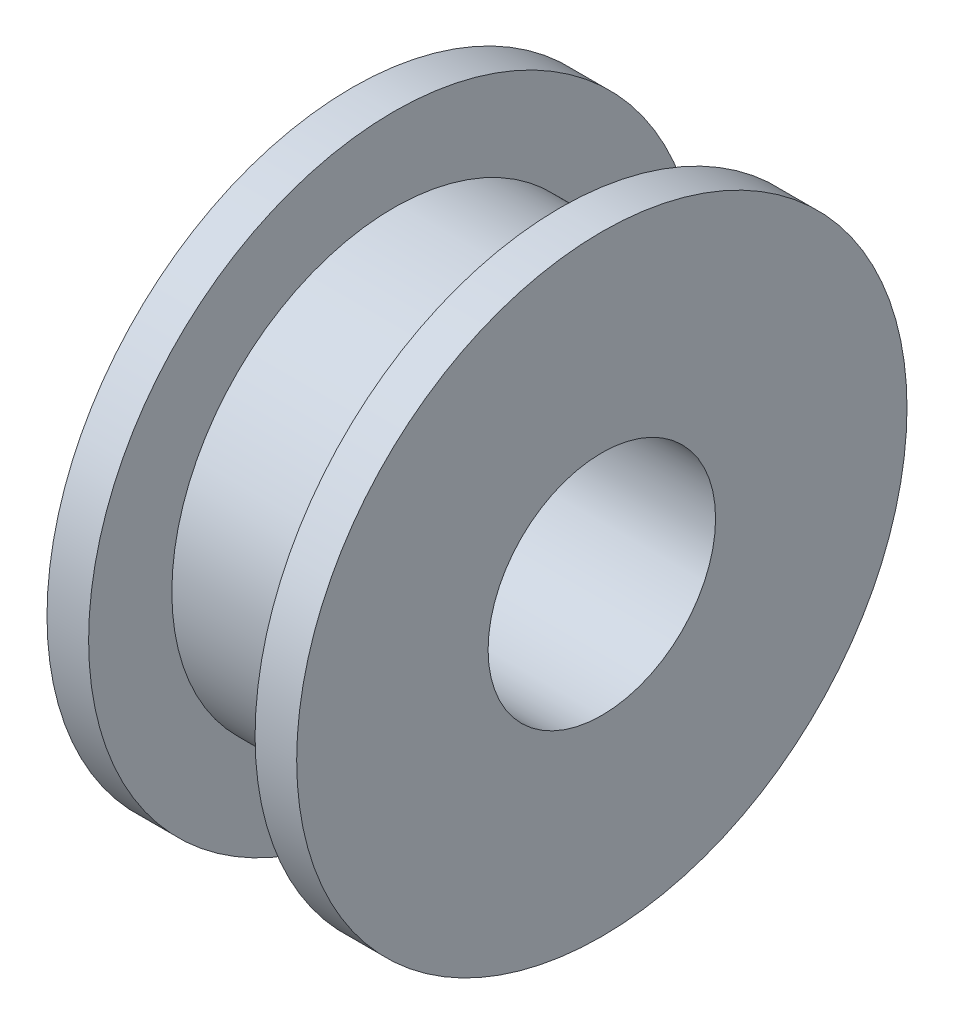
ISO-10303-21;
HEADER;
FILE_DESCRIPTION(('STEP AP214'),'2;1');
FILE_NAME('part.step','',(''),(''),'','','');
FILE_SCHEMA(('AUTOMOTIVE_DESIGN { 1 0 10303 214 1 1 1 1 }'));
ENDSEC;
DATA;
#1=APPLICATION_CONTEXT('core data for automotive mechanical design processes');
#2=APPLICATION_PROTOCOL_DEFINITION('international standard','automotive_design',2000,#1);
#3=PRODUCT_CONTEXT('',#1,'mechanical');
#4=PRODUCT('Part','Part','',(#3));
#5=PRODUCT_RELATED_PRODUCT_CATEGORY('part','',(#4));
#6=PRODUCT_DEFINITION_FORMATION('','',#4);
#7=PRODUCT_DEFINITION_CONTEXT('part definition',#1,'design');
#8=PRODUCT_DEFINITION('design','',#6,#7);
#9=PRODUCT_DEFINITION_SHAPE('','',#8);
#10=(LENGTH_UNIT() NAMED_UNIT(*) SI_UNIT(.MILLI.,.METRE.));
#11=(NAMED_UNIT(*) PLANE_ANGLE_UNIT() SI_UNIT($,.RADIAN.));
#12=(NAMED_UNIT(*) SI_UNIT($,.STERADIAN.) SOLID_ANGLE_UNIT());
#13=UNCERTAINTY_MEASURE_WITH_UNIT(LENGTH_MEASURE(1.E-05),#10,'distance_accuracy_value','');
#14=(GEOMETRIC_REPRESENTATION_CONTEXT(3) GLOBAL_UNCERTAINTY_ASSIGNED_CONTEXT((#13)) GLOBAL_UNIT_ASSIGNED_CONTEXT((#10,
#11,#12)) REPRESENTATION_CONTEXT('',''));
#15=CARTESIAN_POINT('',(0.,0.,0.));
#16=DIRECTION('',(0.,0.,1.));
#17=DIRECTION('',(1.,0.,0.));
#18=AXIS2_PLACEMENT_3D('',#15,#16,#17);
#19=CARTESIAN_POINT('',(0.,0.,0.));
#20=DIRECTION('',(-1.,0.,0.));
#21=DIRECTION('',(0.,0.,1.));
#22=AXIS2_PLACEMENT_3D('',#19,#20,#21);
#23=CYLINDRICAL_SURFACE('',#22,11.);
#24=CARTESIAN_POINT('',(-5.5,0.,0.));
#25=DIRECTION('',(-1.,0.,0.));
#26=DIRECTION('',(0.,0.,1.));
#27=AXIS2_PLACEMENT_3D('',#24,#25,#26);
#28=CIRCLE('',#27,11.);
#29=CARTESIAN_POINT('',(-5.5,0.,11.));
#30=VERTEX_POINT('',#29);
#31=EDGE_CURVE('E50',#30,#30,#28,.T.);
#32=ORIENTED_EDGE('',*,*,#31,.F.);
#33=EDGE_LOOP('',(#32));
#34=FACE_BOUND('',#33,.T.);
#35=CARTESIAN_POINT('',(-4.,0.,0.));
#36=DIRECTION('',(-1.,0.,0.));
#37=DIRECTION('',(0.,0.,1.));
#38=AXIS2_PLACEMENT_3D('',#35,#36,#37);
#39=CIRCLE('',#38,11.);
#40=CARTESIAN_POINT('',(-4.,0.,11.));
#41=VERTEX_POINT('',#40);
#42=EDGE_CURVE('E61',#41,#41,#39,.T.);
#43=ORIENTED_EDGE('',*,*,#42,.T.);
#44=EDGE_LOOP('',(#43));
#45=FACE_BOUND('',#44,.T.);
#46=ADVANCED_FACE('F37',(#34,#45),#23,.T.);
#47=CARTESIAN_POINT('',(3.5,0.,0.));
#48=DIRECTION('',(-1.,0.,0.));
#49=DIRECTION('',(0.,0.,1.));
#50=AXIS2_PLACEMENT_3D('',#47,#48,#49);
#51=CIRCLE('',#50,11.);
#52=CARTESIAN_POINT('',(3.5,0.,11.));
#53=VERTEX_POINT('',#52);
#54=EDGE_CURVE('E55',#53,#53,#51,.T.);
#55=ORIENTED_EDGE('',*,*,#54,.T.);
#56=EDGE_LOOP('',(#55));
#57=FACE_BOUND('',#56,.T.);
#58=CARTESIAN_POINT('',(2.,0.,0.));
#59=DIRECTION('',(-1.,0.,0.));
#60=DIRECTION('',(0.,0.,1.));
#61=AXIS2_PLACEMENT_3D('',#58,#59,#60);
#62=CIRCLE('',#61,11.);
#63=CARTESIAN_POINT('',(2.,0.,11.));
#64=VERTEX_POINT('',#63);
#65=EDGE_CURVE('E73',#64,#64,#62,.T.);
#66=ORIENTED_EDGE('',*,*,#65,.F.);
#67=EDGE_LOOP('',(#66));
#68=FACE_BOUND('',#67,.T.);
#69=ADVANCED_FACE('F81',(#57,#68),#23,.T.);
#70=CARTESIAN_POINT('',(3.5,4.1,0.));
#71=DIRECTION('',(-1.,0.,0.));
#72=DIRECTION('',(0.,0.,1.));
#73=AXIS2_PLACEMENT_3D('',#70,#71,#72);
#74=PLANE('',#73);
#75=ORIENTED_EDGE('',*,*,#54,.F.);
#76=EDGE_LOOP('',(#75));
#77=FACE_BOUND('',#76,.T.);
#78=CARTESIAN_POINT('',(3.5,0.,0.));
#79=DIRECTION('',(-1.,0.,0.));
#80=DIRECTION('',(0.,0.,1.));
#81=AXIS2_PLACEMENT_3D('',#78,#79,#80);
#82=CIRCLE('',#81,4.1);
#83=CARTESIAN_POINT('',(3.5,0.,4.1));
#84=VERTEX_POINT('',#83);
#85=EDGE_CURVE('E10',#84,#84,#82,.T.);
#86=ORIENTED_EDGE('',*,*,#85,.T.);
#87=EDGE_LOOP('',(#86));
#88=FACE_BOUND('',#87,.T.);
#89=ADVANCED_FACE('F39',(#77,#88),#74,.F.);
#90=CARTESIAN_POINT('',(0.,0.,0.));
#91=DIRECTION('',(-1.,0.,0.));
#92=DIRECTION('',(0.,0.,1.));
#93=AXIS2_PLACEMENT_3D('',#90,#91,#92);
#94=CYLINDRICAL_SURFACE('',#93,4.1);
#95=ORIENTED_EDGE('',*,*,#85,.F.);
#96=EDGE_LOOP('',(#95));
#97=FACE_BOUND('',#96,.T.);
#98=CARTESIAN_POINT('',(-5.5,0.,0.));
#99=DIRECTION('',(-1.,0.,0.));
#100=DIRECTION('',(0.,0.,1.));
#101=AXIS2_PLACEMENT_3D('',#98,#99,#100);
#102=CIRCLE('',#101,4.1);
#103=CARTESIAN_POINT('',(-5.5,0.,4.1));
#104=VERTEX_POINT('',#103);
#105=EDGE_CURVE('E45',#104,#104,#102,.T.);
#106=ORIENTED_EDGE('',*,*,#105,.T.);
#107=EDGE_LOOP('',(#106));
#108=FACE_BOUND('',#107,.T.);
#109=ADVANCED_FACE('F89',(#97,#108),#94,.F.);
#110=CARTESIAN_POINT('',(-5.5,11.,0.));
#111=DIRECTION('',(1.,0.,0.));
#112=DIRECTION('',(0.,0.,-1.));
#113=AXIS2_PLACEMENT_3D('',#110,#111,#112);
#114=PLANE('',#113);
#115=ORIENTED_EDGE('',*,*,#105,.F.);
#116=EDGE_LOOP('',(#115));
#117=FACE_BOUND('',#116,.T.);
#118=ORIENTED_EDGE('',*,*,#31,.T.);
#119=EDGE_LOOP('',(#118));
#120=FACE_BOUND('',#119,.T.);
#121=ADVANCED_FACE('F96',(#117,#120),#114,.F.);
#122=CARTESIAN_POINT('',(-4.,11.,0.));
#123=DIRECTION('',(1.,0.,0.));
#124=DIRECTION('',(0.,0.,-1.));
#125=AXIS2_PLACEMENT_3D('',#122,#123,#124);
#126=PLANE('',#125);
#127=CARTESIAN_POINT('',(-4.,0.,0.));
#128=DIRECTION('',(-1.,0.,0.));
#129=DIRECTION('',(0.,0.,1.));
#130=AXIS2_PLACEMENT_3D('',#127,#128,#129);
#131=CIRCLE('',#130,8.);
#132=CARTESIAN_POINT('',(-4.,0.,8.));
#133=VERTEX_POINT('',#132);
#134=EDGE_CURVE('E65',#133,#133,#131,.T.);
#135=ORIENTED_EDGE('',*,*,#134,.T.);
#136=EDGE_LOOP('',(#135));
#137=FACE_BOUND('',#136,.T.);
#138=ORIENTED_EDGE('',*,*,#42,.F.);
#139=EDGE_LOOP('',(#138));
#140=FACE_BOUND('',#139,.T.);
#141=ADVANCED_FACE('F94',(#137,#140),#126,.T.);
#142=CARTESIAN_POINT('',(0.,0.,0.));
#143=DIRECTION('',(-1.,0.,0.));
#144=DIRECTION('',(0.,0.,1.));
#145=AXIS2_PLACEMENT_3D('',#142,#143,#144);
#146=CYLINDRICAL_SURFACE('',#145,8.);
#147=CARTESIAN_POINT('',(2.,0.,0.));
#148=DIRECTION('',(-1.,0.,0.));
#149=DIRECTION('',(0.,0.,1.));
#150=AXIS2_PLACEMENT_3D('',#147,#148,#149);
#151=CIRCLE('',#150,8.);
#152=CARTESIAN_POINT('',(2.,0.,8.));
#153=VERTEX_POINT('',#152);
#154=EDGE_CURVE('E69',#153,#153,#151,.T.);
#155=ORIENTED_EDGE('',*,*,#154,.T.);
#156=EDGE_LOOP('',(#155));
#157=FACE_BOUND('',#156,.T.);
#158=ORIENTED_EDGE('',*,*,#134,.F.);
#159=EDGE_LOOP('',(#158));
#160=FACE_BOUND('',#159,.T.);
#161=ADVANCED_FACE('F116',(#157,#160),#146,.T.);
#162=CARTESIAN_POINT('',(2.,8.,0.));
#163=DIRECTION('',(-1.,0.,0.));
#164=DIRECTION('',(0.,0.,1.));
#165=AXIS2_PLACEMENT_3D('',#162,#163,#164);
#166=PLANE('',#165);
#167=ORIENTED_EDGE('',*,*,#65,.T.);
#168=EDGE_LOOP('',(#167));
#169=FACE_BOUND('',#168,.T.);
#170=ORIENTED_EDGE('',*,*,#154,.F.);
#171=EDGE_LOOP('',(#170));
#172=FACE_BOUND('',#171,.T.);
#173=ADVANCED_FACE('F78',(#169,#172),#166,.T.);
#174=CLOSED_SHELL('',(#46,#69,#89,#109,#121,#141,#161,#173));
#175=MANIFOLD_SOLID_BREP('B2',#174);
#176=ADVANCED_BREP_SHAPE_REPRESENTATION('',(#18,#175),#14);
#177=SHAPE_DEFINITION_REPRESENTATION(#9,#176);
ENDSEC;
END-ISO-10303-21;
